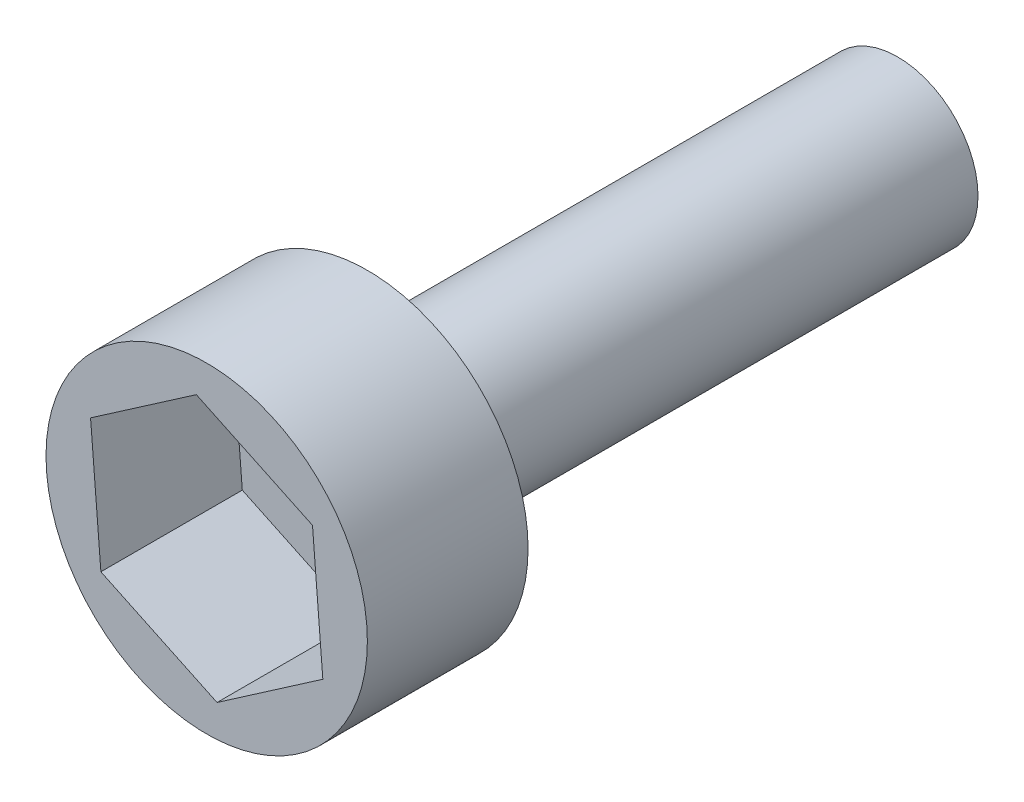
ISO-10303-21;
HEADER;
FILE_DESCRIPTION(('STEP AP214'),'2;1');
FILE_NAME('part.step','',(''),(''),'','','');
FILE_SCHEMA(('AUTOMOTIVE_DESIGN { 1 0 10303 214 1 1 1 1 }'));
ENDSEC;
DATA;
#1=APPLICATION_CONTEXT('core data for automotive mechanical design processes');
#2=APPLICATION_PROTOCOL_DEFINITION('international standard','automotive_design',2000,#1);
#3=PRODUCT_CONTEXT('',#1,'mechanical');
#4=PRODUCT('Part','Part','',(#3));
#5=PRODUCT_RELATED_PRODUCT_CATEGORY('part','',(#4));
#6=PRODUCT_DEFINITION_FORMATION('','',#4);
#7=PRODUCT_DEFINITION_CONTEXT('part definition',#1,'design');
#8=PRODUCT_DEFINITION('design','',#6,#7);
#9=PRODUCT_DEFINITION_SHAPE('','',#8);
#10=(LENGTH_UNIT() NAMED_UNIT(*) SI_UNIT(.MILLI.,.METRE.));
#11=(NAMED_UNIT(*) PLANE_ANGLE_UNIT() SI_UNIT($,.RADIAN.));
#12=(NAMED_UNIT(*) SI_UNIT($,.STERADIAN.) SOLID_ANGLE_UNIT());
#13=UNCERTAINTY_MEASURE_WITH_UNIT(LENGTH_MEASURE(1.E-05),#10,'distance_accuracy_value','');
#14=(GEOMETRIC_REPRESENTATION_CONTEXT(3) GLOBAL_UNCERTAINTY_ASSIGNED_CONTEXT((#13)) GLOBAL_UNIT_ASSIGNED_CONTEXT((#10,
#11,#12)) REPRESENTATION_CONTEXT('',''));
#15=CARTESIAN_POINT('',(0.,0.,0.));
#16=DIRECTION('',(0.,0.,1.));
#17=DIRECTION('',(1.,0.,0.));
#18=AXIS2_PLACEMENT_3D('',#15,#16,#17);
#19=CARTESIAN_POINT('',(0.,0.,-10.4775));
#20=DIRECTION('',(0.,0.,1.));
#21=DIRECTION('',(1.,0.,0.));
#22=AXIS2_PLACEMENT_3D('',#19,#20,#21);
#23=CYLINDRICAL_SURFACE('',#22,1.5875);
#24=CARTESIAN_POINT('',(0.,0.,-10.4775));
#25=DIRECTION('',(0.,0.,1.));
#26=DIRECTION('',(1.,0.,0.));
#27=AXIS2_PLACEMENT_3D('',#24,#25,#26);
#28=CIRCLE('',#27,1.5875);
#29=CARTESIAN_POINT('',(1.5875,0.,-10.4775));
#30=VERTEX_POINT('',#29);
#31=EDGE_CURVE('E11',#30,#30,#28,.T.);
#32=ORIENTED_EDGE('',*,*,#31,.T.);
#33=EDGE_LOOP('',(#32));
#34=FACE_BOUND('',#33,.T.);
#35=CARTESIAN_POINT('',(0.,0.,0.));
#36=DIRECTION('',(0.,0.,1.));
#37=DIRECTION('',(1.,0.,0.));
#38=AXIS2_PLACEMENT_3D('',#35,#36,#37);
#39=CIRCLE('',#38,1.5875);
#40=CARTESIAN_POINT('',(1.5875,0.,0.));
#41=VERTEX_POINT('',#40);
#42=EDGE_CURVE('E42',#41,#41,#39,.T.);
#43=ORIENTED_EDGE('',*,*,#42,.F.);
#44=EDGE_LOOP('',(#43));
#45=FACE_BOUND('',#44,.T.);
#46=ADVANCED_FACE('F39',(#34,#45),#23,.T.);
#47=CARTESIAN_POINT('',(0.,0.,-10.4775));
#48=DIRECTION('',(0.,0.,1.));
#49=DIRECTION('',(1.,0.,0.));
#50=AXIS2_PLACEMENT_3D('',#47,#48,#49);
#51=PLANE('',#50);
#52=ORIENTED_EDGE('',*,*,#31,.F.);
#53=EDGE_LOOP('',(#52));
#54=FACE_BOUND('',#53,.T.);
#55=ADVANCED_FACE('F190',(#54),#51,.F.);
#56=CARTESIAN_POINT('',(0.,0.,3.175));
#57=DIRECTION('',(0.,0.,-1.));
#58=DIRECTION('',(-1.,0.,0.));
#59=AXIS2_PLACEMENT_3D('',#56,#57,#58);
#60=CYLINDRICAL_SURFACE('',#59,3.175);
#61=CARTESIAN_POINT('',(0.,0.,3.175));
#62=DIRECTION('',(0.,0.,1.));
#63=DIRECTION('',(1.,0.,0.));
#64=AXIS2_PLACEMENT_3D('',#61,#62,#63);
#65=CIRCLE('',#64,3.175);
#66=CARTESIAN_POINT('',(3.175,0.,3.175));
#67=VERTEX_POINT('',#66);
#68=EDGE_CURVE('E163',#67,#67,#65,.T.);
#69=ORIENTED_EDGE('',*,*,#68,.F.);
#70=EDGE_LOOP('',(#69));
#71=FACE_BOUND('',#70,.T.);
#72=CARTESIAN_POINT('',(0.,0.,0.));
#73=DIRECTION('',(0.,0.,1.));
#74=DIRECTION('',(1.,0.,0.));
#75=AXIS2_PLACEMENT_3D('',#72,#73,#74);
#76=CIRCLE('',#75,3.175);
#77=CARTESIAN_POINT('',(3.175,0.,0.));
#78=VERTEX_POINT('',#77);
#79=EDGE_CURVE('E153',#78,#78,#76,.T.);
#80=ORIENTED_EDGE('',*,*,#79,.T.);
#81=EDGE_LOOP('',(#80));
#82=FACE_BOUND('',#81,.T.);
#83=ADVANCED_FACE('F171',(#71,#82),#60,.T.);
#84=CARTESIAN_POINT('',(0.,0.,3.175));
#85=DIRECTION('',(0.,0.,1.));
#86=DIRECTION('',(1.,0.,0.));
#87=AXIS2_PLACEMENT_3D('',#84,#85,#86);
#88=PLANE('',#87);
#89=DIRECTION('',(0.823027595520028,0.568001388213551,0.));
#90=VECTOR('',#89,1.);
#91=CARTESIAN_POINT('',(0.204190177897079,-2.53177928960057,3.175));
#92=LINE('',#91,#90);
#93=CARTESIAN_POINT('',(0.204190177897079,-2.53177928960057,3.175));
#94=VERTEX_POINT('',#93);
#95=CARTESIAN_POINT('',(2.29468027051795,-1.08905576353815,3.175));
#96=VERTEX_POINT('',#95);
#97=EDGE_CURVE('E54',#94,#96,#92,.T.);
#98=ORIENTED_EDGE('',*,*,#97,.F.);
#99=DIRECTION('',(0.903417429337776,-0.428762111629193,0.));
#100=VECTOR('',#99,1.);
#101=CARTESIAN_POINT('',(-2.09049009262087,-1.44272352606242,3.175));
#102=LINE('',#101,#100);
#103=CARTESIAN_POINT('',(-2.09049009262087,-1.44272352606242,3.175));
#104=VERTEX_POINT('',#103);
#105=EDGE_CURVE('E147',#104,#94,#102,.T.);
#106=ORIENTED_EDGE('',*,*,#105,.F.);
#107=DIRECTION('',(0.0803898338177479,-0.996763499842743,0.));
#108=VECTOR('',#107,1.);
#109=CARTESIAN_POINT('',(-2.29468027051795,1.08905576353815,3.175));
#110=LINE('',#109,#108);
#111=CARTESIAN_POINT('',(-2.29468027051795,1.08905576353815,3.175));
#112=VERTEX_POINT('',#111);
#113=EDGE_CURVE('E144',#112,#104,#110,.T.);
#114=ORIENTED_EDGE('',*,*,#113,.F.);
#115=DIRECTION('',(-0.823027595520028,-0.568001388213551,0.));
#116=VECTOR('',#115,1.);
#117=CARTESIAN_POINT('',(-0.204190177897079,2.53177928960057,3.175));
#118=LINE('',#117,#116);
#119=CARTESIAN_POINT('',(-0.204190177897079,2.53177928960057,3.175));
#120=VERTEX_POINT('',#119);
#121=EDGE_CURVE('E102',#120,#112,#118,.T.);
#122=ORIENTED_EDGE('',*,*,#121,.F.);
#123=DIRECTION('',(-0.903417429337776,0.428762111629193,0.));
#124=VECTOR('',#123,1.);
#125=CARTESIAN_POINT('',(2.09049009262087,1.44272352606242,3.175));
#126=LINE('',#125,#124);
#127=CARTESIAN_POINT('',(2.09049009262087,1.44272352606242,3.175));
#128=VERTEX_POINT('',#127);
#129=EDGE_CURVE('E138',#128,#120,#126,.T.);
#130=ORIENTED_EDGE('',*,*,#129,.F.);
#131=DIRECTION('',(-0.0803898338177483,0.996763499842743,0.));
#132=VECTOR('',#131,1.);
#133=CARTESIAN_POINT('',(2.29468027051795,-1.08905576353815,3.175));
#134=LINE('',#133,#132);
#135=EDGE_CURVE('E134',#96,#128,#134,.T.);
#136=ORIENTED_EDGE('',*,*,#135,.F.);
#137=EDGE_LOOP('',(#98,#106,#114,#122,#130,#136));
#138=FACE_BOUND('',#137,.T.);
#139=ORIENTED_EDGE('',*,*,#68,.T.);
#140=EDGE_LOOP('',(#139));
#141=FACE_BOUND('',#140,.T.);
#142=ADVANCED_FACE('F176',(#138,#141),#88,.T.);
#143=CARTESIAN_POINT('',(0.,0.,0.));
#144=DIRECTION('',(0.,0.,1.));
#145=DIRECTION('',(1.,0.,0.));
#146=AXIS2_PLACEMENT_3D('',#143,#144,#145);
#147=PLANE('',#146);
#148=ORIENTED_EDGE('',*,*,#42,.T.);
#149=EDGE_LOOP('',(#148));
#150=FACE_BOUND('',#149,.T.);
#151=ORIENTED_EDGE('',*,*,#79,.F.);
#152=EDGE_LOOP('',(#151));
#153=FACE_BOUND('',#152,.T.);
#154=ADVANCED_FACE('F173',(#150,#153),#147,.F.);
#155=CARTESIAN_POINT('',(0.204190177897079,-2.53177928960057,0.381));
#156=DIRECTION('',(0.568001388213551,-0.823027595520028,0.));
#157=DIRECTION('',(0.823027595520028,0.568001388213551,0.));
#158=AXIS2_PLACEMENT_3D('',#155,#156,#157);
#159=PLANE('',#158);
#160=ORIENTED_EDGE('',*,*,#97,.T.);
#161=DIRECTION('',(0.,0.,1.));
#162=VECTOR('',#161,1.);
#163=CARTESIAN_POINT('',(2.29468027051795,-1.08905576353815,0.381));
#164=LINE('',#163,#162);
#165=CARTESIAN_POINT('',(2.29468027051795,-1.08905576353815,0.381));
#166=VERTEX_POINT('',#165);
#167=EDGE_CURVE('E84',#166,#96,#164,.T.);
#168=ORIENTED_EDGE('',*,*,#167,.F.);
#169=DIRECTION('',(0.823027595520028,0.568001388213551,0.));
#170=VECTOR('',#169,1.);
#171=CARTESIAN_POINT('',(0.204190177897079,-2.53177928960057,0.381));
#172=LINE('',#171,#170);
#173=CARTESIAN_POINT('',(0.204190177897079,-2.53177928960057,0.381));
#174=VERTEX_POINT('',#173);
#175=EDGE_CURVE('E150',#174,#166,#172,.T.);
#176=ORIENTED_EDGE('',*,*,#175,.F.);
#177=DIRECTION('',(0.,0.,1.));
#178=VECTOR('',#177,1.);
#179=CARTESIAN_POINT('',(0.204190177897079,-2.53177928960057,0.381));
#180=LINE('',#179,#178);
#181=EDGE_CURVE('E62',#174,#94,#180,.T.);
#182=ORIENTED_EDGE('',*,*,#181,.T.);
#183=EDGE_LOOP('',(#160,#168,#176,#182));
#184=FACE_BOUND('',#183,.T.);
#185=ADVANCED_FACE('F175',(#184),#159,.F.);
#186=CARTESIAN_POINT('',(-2.09049009262087,-1.44272352606242,0.381));
#187=DIRECTION('',(-0.428762111629193,-0.903417429337776,0.));
#188=DIRECTION('',(0.903417429337776,-0.428762111629193,0.));
#189=AXIS2_PLACEMENT_3D('',#186,#187,#188);
#190=PLANE('',#189);
#191=ORIENTED_EDGE('',*,*,#105,.T.);
#192=ORIENTED_EDGE('',*,*,#181,.F.);
#193=DIRECTION('',(0.903417429337776,-0.428762111629193,0.));
#194=VECTOR('',#193,1.);
#195=CARTESIAN_POINT('',(-2.09049009262087,-1.44272352606242,0.381));
#196=LINE('',#195,#194);
#197=CARTESIAN_POINT('',(-2.09049009262087,-1.44272352606242,0.381));
#198=VERTEX_POINT('',#197);
#199=EDGE_CURVE('E116',#198,#174,#196,.T.);
#200=ORIENTED_EDGE('',*,*,#199,.F.);
#201=DIRECTION('',(0.,0.,1.));
#202=VECTOR('',#201,1.);
#203=CARTESIAN_POINT('',(-2.09049009262087,-1.44272352606242,0.381));
#204=LINE('',#203,#202);
#205=EDGE_CURVE('E107',#198,#104,#204,.T.);
#206=ORIENTED_EDGE('',*,*,#205,.T.);
#207=EDGE_LOOP('',(#191,#192,#200,#206));
#208=FACE_BOUND('',#207,.T.);
#209=ADVANCED_FACE('F183',(#208),#190,.F.);
#210=CARTESIAN_POINT('',(-2.29468027051795,1.08905576353815,0.381));
#211=DIRECTION('',(-0.996763499842744,-0.080389833817748,0.));
#212=DIRECTION('',(0.080389833817748,-0.996763499842744,0.));
#213=AXIS2_PLACEMENT_3D('',#210,#211,#212);
#214=PLANE('',#213);
#215=ORIENTED_EDGE('',*,*,#113,.T.);
#216=ORIENTED_EDGE('',*,*,#205,.F.);
#217=DIRECTION('',(0.0803898338177479,-0.996763499842743,0.));
#218=VECTOR('',#217,1.);
#219=CARTESIAN_POINT('',(-2.29468027051795,1.08905576353815,0.381));
#220=LINE('',#219,#218);
#221=CARTESIAN_POINT('',(-2.29468027051795,1.08905576353815,0.381));
#222=VERTEX_POINT('',#221);
#223=EDGE_CURVE('E111',#222,#198,#220,.T.);
#224=ORIENTED_EDGE('',*,*,#223,.F.);
#225=DIRECTION('',(0.,0.,1.));
#226=VECTOR('',#225,1.);
#227=CARTESIAN_POINT('',(-2.29468027051795,1.08905576353815,0.381));
#228=LINE('',#227,#226);
#229=EDGE_CURVE('E95',#222,#112,#228,.T.);
#230=ORIENTED_EDGE('',*,*,#229,.T.);
#231=EDGE_LOOP('',(#215,#216,#224,#230));
#232=FACE_BOUND('',#231,.T.);
#233=ADVANCED_FACE('F112',(#232),#214,.F.);
#234=CARTESIAN_POINT('',(-0.204190177897079,2.53177928960057,0.381));
#235=DIRECTION('',(-0.568001388213551,0.823027595520028,0.));
#236=DIRECTION('',(-0.823027595520028,-0.568001388213551,0.));
#237=AXIS2_PLACEMENT_3D('',#234,#235,#236);
#238=PLANE('',#237);
#239=ORIENTED_EDGE('',*,*,#121,.T.);
#240=ORIENTED_EDGE('',*,*,#229,.F.);
#241=DIRECTION('',(-0.823027595520028,-0.568001388213551,0.));
#242=VECTOR('',#241,1.);
#243=CARTESIAN_POINT('',(-0.204190177897079,2.53177928960057,0.381));
#244=LINE('',#243,#242);
#245=CARTESIAN_POINT('',(-0.204190177897079,2.53177928960057,0.381));
#246=VERTEX_POINT('',#245);
#247=EDGE_CURVE('E99',#246,#222,#244,.T.);
#248=ORIENTED_EDGE('',*,*,#247,.F.);
#249=DIRECTION('',(0.,0.,1.));
#250=VECTOR('',#249,1.);
#251=CARTESIAN_POINT('',(-0.204190177897079,2.53177928960057,0.381));
#252=LINE('',#251,#250);
#253=EDGE_CURVE('E108',#246,#120,#252,.T.);
#254=ORIENTED_EDGE('',*,*,#253,.T.);
#255=EDGE_LOOP('',(#239,#240,#248,#254));
#256=FACE_BOUND('',#255,.T.);
#257=ADVANCED_FACE('F97',(#256),#238,.F.);
#258=CARTESIAN_POINT('',(2.09049009262087,1.44272352606242,0.381));
#259=DIRECTION('',(0.428762111629192,0.903417429337776,0.));
#260=DIRECTION('',(-0.903417429337776,0.428762111629192,0.));
#261=AXIS2_PLACEMENT_3D('',#258,#259,#260);
#262=PLANE('',#261);
#263=ORIENTED_EDGE('',*,*,#129,.T.);
#264=ORIENTED_EDGE('',*,*,#253,.F.);
#265=DIRECTION('',(-0.903417429337776,0.428762111629193,0.));
#266=VECTOR('',#265,1.);
#267=CARTESIAN_POINT('',(2.09049009262087,1.44272352606242,0.381));
#268=LINE('',#267,#266);
#269=CARTESIAN_POINT('',(2.09049009262087,1.44272352606242,0.381));
#270=VERTEX_POINT('',#269);
#271=EDGE_CURVE('E122',#270,#246,#268,.T.);
#272=ORIENTED_EDGE('',*,*,#271,.F.);
#273=DIRECTION('',(0.,0.,1.));
#274=VECTOR('',#273,1.);
#275=CARTESIAN_POINT('',(2.09049009262087,1.44272352606242,0.381));
#276=LINE('',#275,#274);
#277=EDGE_CURVE('E158',#270,#128,#276,.T.);
#278=ORIENTED_EDGE('',*,*,#277,.T.);
#279=EDGE_LOOP('',(#263,#264,#272,#278));
#280=FACE_BOUND('',#279,.T.);
#281=ADVANCED_FACE('F245',(#280),#262,.F.);
#282=CARTESIAN_POINT('',(2.29468027051795,-1.08905576353815,0.381));
#283=DIRECTION('',(0.996763499842744,0.0803898338177483,0.));
#284=DIRECTION('',(-0.0803898338177483,0.996763499842744,0.));
#285=AXIS2_PLACEMENT_3D('',#282,#283,#284);
#286=PLANE('',#285);
#287=ORIENTED_EDGE('',*,*,#135,.T.);
#288=ORIENTED_EDGE('',*,*,#277,.F.);
#289=DIRECTION('',(-0.0803898338177483,0.996763499842743,0.));
#290=VECTOR('',#289,1.);
#291=CARTESIAN_POINT('',(2.29468027051795,-1.08905576353815,0.381));
#292=LINE('',#291,#290);
#293=EDGE_CURVE('E126',#166,#270,#292,.T.);
#294=ORIENTED_EDGE('',*,*,#293,.F.);
#295=ORIENTED_EDGE('',*,*,#167,.T.);
#296=EDGE_LOOP('',(#287,#288,#294,#295));
#297=FACE_BOUND('',#296,.T.);
#298=ADVANCED_FACE('F254',(#297),#286,.F.);
#299=CARTESIAN_POINT('',(0.,0.,0.381));
#300=DIRECTION('',(0.,0.,1.));
#301=DIRECTION('',(1.,0.,0.));
#302=AXIS2_PLACEMENT_3D('',#299,#300,#301);
#303=PLANE('',#302);
#304=ORIENTED_EDGE('',*,*,#175,.T.);
#305=ORIENTED_EDGE('',*,*,#293,.T.);
#306=ORIENTED_EDGE('',*,*,#271,.T.);
#307=ORIENTED_EDGE('',*,*,#247,.T.);
#308=ORIENTED_EDGE('',*,*,#223,.T.);
#309=ORIENTED_EDGE('',*,*,#199,.T.);
#310=EDGE_LOOP('',(#304,#305,#306,#307,#308,#309));
#311=FACE_BOUND('',#310,.T.);
#312=ADVANCED_FACE('F119',(#311),#303,.T.);
#313=CLOSED_SHELL('',(#46,#55,#83,#142,#154,#185,#209,#233,#257,#281,#298,#312));
#314=MANIFOLD_SOLID_BREP('B2',#313);
#315=ADVANCED_BREP_SHAPE_REPRESENTATION('',(#18,#314),#14);
#316=SHAPE_DEFINITION_REPRESENTATION(#9,#315);
ENDSEC;
END-ISO-10303-21;
